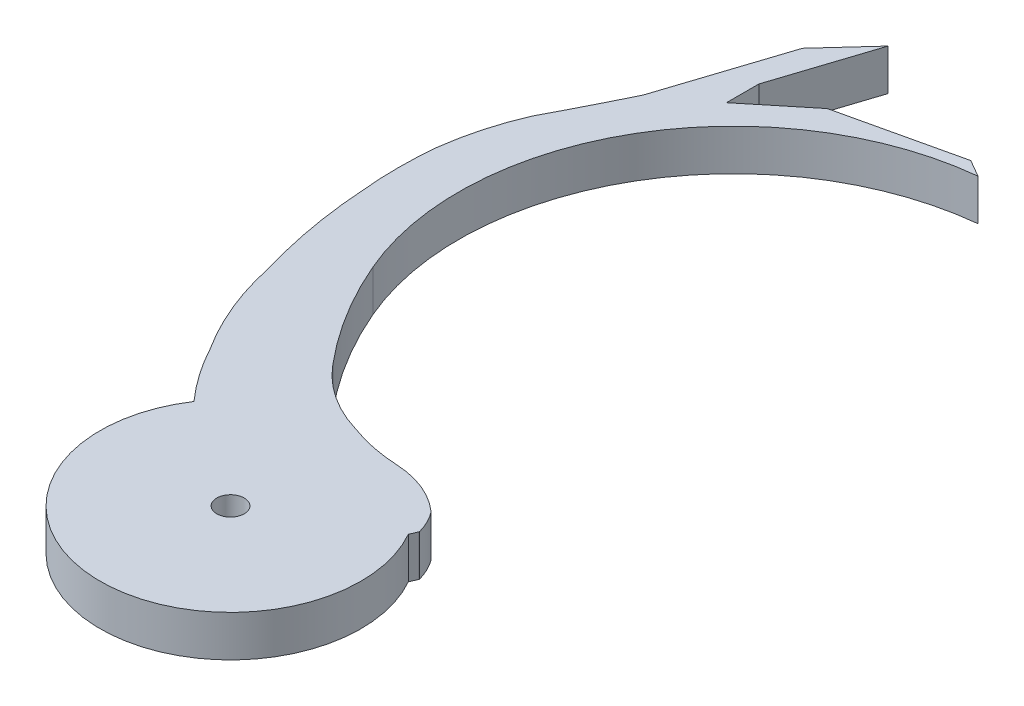
ISO-10303-21;
HEADER;
FILE_DESCRIPTION(('STEP AP214'),'2;1');
FILE_NAME('part.step','',(''),(''),'','','');
FILE_SCHEMA(('AUTOMOTIVE_DESIGN { 1 0 10303 214 1 1 1 1 }'));
ENDSEC;
DATA;
#1=APPLICATION_CONTEXT('core data for automotive mechanical design processes');
#2=APPLICATION_PROTOCOL_DEFINITION('international standard','automotive_design',2000,#1);
#3=PRODUCT_CONTEXT('',#1,'mechanical');
#4=PRODUCT('Part','Part','',(#3));
#5=PRODUCT_RELATED_PRODUCT_CATEGORY('part','',(#4));
#6=PRODUCT_DEFINITION_FORMATION('','',#4);
#7=PRODUCT_DEFINITION_CONTEXT('part definition',#1,'design');
#8=PRODUCT_DEFINITION('design','',#6,#7);
#9=PRODUCT_DEFINITION_SHAPE('','',#8);
#10=(LENGTH_UNIT() NAMED_UNIT(*) SI_UNIT(.MILLI.,.METRE.));
#11=(NAMED_UNIT(*) PLANE_ANGLE_UNIT() SI_UNIT($,.RADIAN.));
#12=(NAMED_UNIT(*) SI_UNIT($,.STERADIAN.) SOLID_ANGLE_UNIT());
#13=UNCERTAINTY_MEASURE_WITH_UNIT(LENGTH_MEASURE(1.E-05),#10,'distance_accuracy_value','');
#14=(GEOMETRIC_REPRESENTATION_CONTEXT(3) GLOBAL_UNCERTAINTY_ASSIGNED_CONTEXT((#13)) GLOBAL_UNIT_ASSIGNED_CONTEXT((#10,
#11,#12)) REPRESENTATION_CONTEXT('',''));
#15=CARTESIAN_POINT('',(0.,0.,0.));
#16=DIRECTION('',(0.,0.,1.));
#17=DIRECTION('',(1.,0.,0.));
#18=AXIS2_PLACEMENT_3D('',#15,#16,#17);
#19=CARTESIAN_POINT('',(-22.562440081917,4.06663709645986,-11.3836875645976));
#20=DIRECTION('',(1.,0.,0.));
#21=DIRECTION('',(0.,0.,-1.));
#22=AXIS2_PLACEMENT_3D('',#19,#20,#21);
#23=PLANE('',#22);
#24=DIRECTION('',(0.,0.,1.));
#25=VECTOR('',#24,1.);
#26=CARTESIAN_POINT('',(-22.562440081917,-1.18336290354014,-11.3836875645976));
#27=LINE('',#26,#25);
#28=CARTESIAN_POINT('',(-22.5624400819171,-1.18336290354014,-43.9022030869811));
#29=VERTEX_POINT('',#28);
#30=CARTESIAN_POINT('',(-22.562440081917,-1.18336290354014,-39.7742396032978));
#31=VERTEX_POINT('',#30);
#32=EDGE_CURVE('E222',#29,#31,#27,.T.);
#33=ORIENTED_EDGE('',*,*,#32,.F.);
#34=DIRECTION('',(0.,-1.,0.));
#35=VECTOR('',#34,1.);
#36=CARTESIAN_POINT('',(-22.5624400819171,4.06663709645986,-43.9022030869811));
#37=LINE('',#36,#35);
#38=CARTESIAN_POINT('',(-22.5624400819171,4.06663709645986,-43.9022030869811));
#39=VERTEX_POINT('',#38);
#40=EDGE_CURVE('E11',#39,#29,#37,.T.);
#41=ORIENTED_EDGE('',*,*,#40,.F.);
#42=DIRECTION('',(0.,0.,1.));
#43=VECTOR('',#42,1.);
#44=CARTESIAN_POINT('',(-22.562440081917,4.06663709645986,-11.3836875645976));
#45=LINE('',#44,#43);
#46=CARTESIAN_POINT('',(-22.562440081917,4.06663709645986,-39.7742396032978));
#47=VERTEX_POINT('',#46);
#48=EDGE_CURVE('E270',#39,#47,#45,.T.);
#49=ORIENTED_EDGE('',*,*,#48,.T.);
#50=DIRECTION('',(0.,-1.,0.));
#51=VECTOR('',#50,1.);
#52=CARTESIAN_POINT('',(-22.562440081917,4.06663709645986,-39.7742396032978));
#53=LINE('',#52,#51);
#54=EDGE_CURVE('E134',#47,#31,#53,.T.);
#55=ORIENTED_EDGE('',*,*,#54,.T.);
#56=EDGE_LOOP('',(#33,#41,#49,#55));
#57=FACE_BOUND('',#56,.T.);
#58=ADVANCED_FACE('F41',(#57),#23,.T.);
#59=CARTESIAN_POINT('',(-28.7450944321391,4.06663709645986,-24.9176323786269));
#60=DIRECTION('',(0.9508473764207,0.,0.30965992112941));
#61=DIRECTION('',(0.30965992112941,0.,-0.9508473764207));
#62=AXIS2_PLACEMENT_3D('',#59,#60,#61);
#63=PLANE('',#62);
#64=DIRECTION('',(-0.30965992112941,0.,0.9508473764207));
#65=VECTOR('',#64,1.);
#66=CARTESIAN_POINT('',(-28.7450944321391,-1.18336290354014,-24.9176323786269));
#67=LINE('',#66,#65);
#68=CARTESIAN_POINT('',(-18.5190078594824,-1.18336290354014,-56.3180394871661));
#69=VERTEX_POINT('',#68);
#70=EDGE_CURVE('E225',#69,#29,#67,.T.);
#71=ORIENTED_EDGE('',*,*,#70,.F.);
#72=DIRECTION('',(0.,-1.,0.));
#73=VECTOR('',#72,1.);
#74=CARTESIAN_POINT('',(-18.5190078594824,4.06663709645986,-56.3180394871661));
#75=LINE('',#74,#73);
#76=CARTESIAN_POINT('',(-18.5190078594824,4.06663709645986,-56.3180394871661));
#77=VERTEX_POINT('',#76);
#78=EDGE_CURVE('E50',#77,#69,#75,.T.);
#79=ORIENTED_EDGE('',*,*,#78,.F.);
#80=DIRECTION('',(-0.30965992112941,0.,0.9508473764207));
#81=VECTOR('',#80,1.);
#82=CARTESIAN_POINT('',(-28.7450944321391,4.06663709645986,-24.9176323786269));
#83=LINE('',#82,#81);
#84=EDGE_CURVE('E335',#77,#39,#83,.T.);
#85=ORIENTED_EDGE('',*,*,#84,.T.);
#86=ORIENTED_EDGE('',*,*,#40,.T.);
#87=EDGE_LOOP('',(#71,#79,#85,#86));
#88=FACE_BOUND('',#87,.T.);
#89=ADVANCED_FACE('F334',(#88),#63,.T.);
#90=CARTESIAN_POINT('',(-26.6414658537518,4.06663709645986,-47.4269807712445));
#91=DIRECTION('',(0.738297960081065,0.,0.674474700889617));
#92=DIRECTION('',(0.674474700889617,0.,-0.738297960081065));
#93=AXIS2_PLACEMENT_3D('',#90,#91,#92);
#94=PLANE('',#93);
#95=DIRECTION('',(-0.674474700889617,0.,0.738297960081065));
#96=VECTOR('',#95,1.);
#97=CARTESIAN_POINT('',(-26.6414658537518,-1.18336290354014,-47.4269807712445));
#98=LINE('',#97,#96);
#99=CARTESIAN_POINT('',(-23.7263406167607,-1.18336290354014,-50.6179544475183));
#100=VERTEX_POINT('',#99);
#101=EDGE_CURVE('E228',#69,#100,#98,.T.);
#102=ORIENTED_EDGE('',*,*,#101,.T.);
#103=DIRECTION('',(0.,-1.,0.));
#104=VECTOR('',#103,1.);
#105=CARTESIAN_POINT('',(-23.7263406167607,4.06663709645986,-50.6179544475183));
#106=LINE('',#105,#104);
#107=CARTESIAN_POINT('',(-23.7263406167607,4.06663709645986,-50.6179544475183));
#108=VERTEX_POINT('',#107);
#109=EDGE_CURVE('E317',#108,#100,#106,.T.);
#110=ORIENTED_EDGE('',*,*,#109,.F.);
#111=DIRECTION('',(-0.674474700889617,0.,0.738297960081065));
#112=VECTOR('',#111,1.);
#113=CARTESIAN_POINT('',(-26.6414658537518,4.06663709645986,-47.4269807712445));
#114=LINE('',#113,#112);
#115=EDGE_CURVE('E325',#77,#108,#114,.T.);
#116=ORIENTED_EDGE('',*,*,#115,.F.);
#117=ORIENTED_EDGE('',*,*,#78,.T.);
#118=EDGE_LOOP('',(#102,#110,#116,#117));
#119=FACE_BOUND('',#118,.T.);
#120=ADVANCED_FACE('F323',(#119),#94,.F.);
#121=CARTESIAN_POINT('',(-31.7747706861074,4.06663709645986,-25.9042989384933));
#122=DIRECTION('',(0.950847376420702,0.,0.309659921129401));
#123=DIRECTION('',(0.309659921129401,0.,-0.950847376420702));
#124=AXIS2_PLACEMENT_3D('',#121,#122,#123);
#125=PLANE('',#124);
#126=DIRECTION('',(-0.309659921129401,0.,0.950847376420703));
#127=VECTOR('',#126,1.);
#128=CARTESIAN_POINT('',(-31.7747706861074,-1.18336290354014,-25.9042989384933));
#129=LINE('',#128,#127);
#130=CARTESIAN_POINT('',(-28.708043021893,-1.18336290354014,-35.3210485878498));
#131=VERTEX_POINT('',#130);
#132=EDGE_CURVE('E230',#100,#131,#129,.T.);
#133=ORIENTED_EDGE('',*,*,#132,.T.);
#134=DIRECTION('',(0.,-1.,0.));
#135=VECTOR('',#134,1.);
#136=CARTESIAN_POINT('',(-28.708043021893,4.06663709645986,-35.3210485878498));
#137=LINE('',#136,#135);
#138=CARTESIAN_POINT('',(-28.708043021893,4.06663709645986,-35.3210485878498));
#139=VERTEX_POINT('',#138);
#140=EDGE_CURVE('E314',#139,#131,#137,.T.);
#141=ORIENTED_EDGE('',*,*,#140,.F.);
#142=DIRECTION('',(-0.309659921129401,0.,0.950847376420703));
#143=VECTOR('',#142,1.);
#144=CARTESIAN_POINT('',(-31.7747706861074,4.06663709645986,-25.9042989384933));
#145=LINE('',#144,#143);
#146=EDGE_CURVE('E344',#108,#139,#145,.T.);
#147=ORIENTED_EDGE('',*,*,#146,.F.);
#148=ORIENTED_EDGE('',*,*,#109,.T.);
#149=EDGE_LOOP('',(#133,#141,#147,#148));
#150=FACE_BOUND('',#149,.T.);
#151=ADVANCED_FACE('F448',(#150),#125,.F.);
#152=CARTESIAN_POINT('',(-295.873895869123,4.06663709645986,-164.689659395593));
#153=DIRECTION('',(0.,-1.,0.));
#154=DIRECTION('',(0.,0.,-1.));
#155=AXIS2_PLACEMENT_3D('',#152,#153,#154);
#156=CYLINDRICAL_SURFACE('',#155,296.8397385626);
#157=CARTESIAN_POINT('',(-295.873895869123,-1.18336290354014,-164.689659395593));
#158=DIRECTION('',(0.,1.,0.));
#159=DIRECTION('',(0.,0.,1.));
#160=AXIS2_PLACEMENT_3D('',#157,#158,#159);
#161=CIRCLE('',#160,296.8397385626);
#162=CARTESIAN_POINT('',(-33.4652339449699,-1.18336290354014,-25.9253825189827));
#163=VERTEX_POINT('',#162);
#164=EDGE_CURVE('E232',#131,#163,#161,.F.);
#165=ORIENTED_EDGE('',*,*,#164,.T.);
#166=DIRECTION('',(0.,-1.,0.));
#167=VECTOR('',#166,1.);
#168=CARTESIAN_POINT('',(-33.4652339449699,4.06663709645986,-25.9253825189827));
#169=LINE('',#168,#167);
#170=CARTESIAN_POINT('',(-33.4652339449699,4.06663709645986,-25.9253825189827));
#171=VERTEX_POINT('',#170);
#172=EDGE_CURVE('E311',#171,#163,#169,.T.);
#173=ORIENTED_EDGE('',*,*,#172,.F.);
#174=CARTESIAN_POINT('',(-295.873895869123,4.06663709645986,-164.689659395593));
#175=DIRECTION('',(0.,1.,0.));
#176=DIRECTION('',(0.,0.,1.));
#177=AXIS2_PLACEMENT_3D('',#174,#175,#176);
#178=CIRCLE('',#177,296.8397385626);
#179=EDGE_CURVE('E346',#139,#171,#178,.F.);
#180=ORIENTED_EDGE('',*,*,#179,.F.);
#181=ORIENTED_EDGE('',*,*,#140,.T.);
#182=EDGE_LOOP('',(#165,#173,#180,#181));
#183=FACE_BOUND('',#182,.T.);
#184=ADVANCED_FACE('F443',(#183),#156,.F.);
#185=CARTESIAN_POINT('',(-1.11166103626462,4.06663709645986,-11.9503457248283));
#186=DIRECTION('',(0.,-1.,0.));
#187=DIRECTION('',(0.,0.,-1.));
#188=AXIS2_PLACEMENT_3D('',#185,#186,#187);
#189=CYLINDRICAL_SURFACE('',#188,35.2428054126922);
#190=CARTESIAN_POINT('',(-1.11166103626462,-1.18336290354014,-11.9503457248283));
#191=DIRECTION('',(0.,1.,0.));
#192=DIRECTION('',(0.,0.,1.));
#193=AXIS2_PLACEMENT_3D('',#190,#191,#192);
#194=CIRCLE('',#193,35.2428054126922);
#195=CARTESIAN_POINT('',(-36.0771724864214,-1.18336290354014,-16.3626401830255));
#196=VERTEX_POINT('',#195);
#197=EDGE_CURVE('E234',#163,#196,#194,.T.);
#198=ORIENTED_EDGE('',*,*,#197,.T.);
#199=DIRECTION('',(0.,-1.,0.));
#200=VECTOR('',#199,1.);
#201=CARTESIAN_POINT('',(-36.0771724864214,4.06663709645986,-16.3626401830255));
#202=LINE('',#201,#200);
#203=CARTESIAN_POINT('',(-36.0771724864214,4.06663709645986,-16.3626401830255));
#204=VERTEX_POINT('',#203);
#205=EDGE_CURVE('E308',#204,#196,#202,.T.);
#206=ORIENTED_EDGE('',*,*,#205,.F.);
#207=CARTESIAN_POINT('',(-1.11166103626462,4.06663709645986,-11.9503457248283));
#208=DIRECTION('',(0.,1.,0.));
#209=DIRECTION('',(0.,0.,1.));
#210=AXIS2_PLACEMENT_3D('',#207,#208,#209);
#211=CIRCLE('',#210,35.2428054126922);
#212=EDGE_CURVE('E348',#171,#204,#211,.T.);
#213=ORIENTED_EDGE('',*,*,#212,.F.);
#214=ORIENTED_EDGE('',*,*,#172,.T.);
#215=EDGE_LOOP('',(#198,#206,#213,#214));
#216=FACE_BOUND('',#215,.T.);
#217=ADVANCED_FACE('F440',(#216),#189,.T.);
#218=CARTESIAN_POINT('',(11.2084770385272,4.06663709645986,-11.6995461847937));
#219=DIRECTION('',(0.,-1.,0.));
#220=DIRECTION('',(0.,0.,-1.));
#221=AXIS2_PLACEMENT_3D('',#218,#219,#220);
#222=CYLINDRICAL_SURFACE('',#221,47.5150196951725);
#223=CARTESIAN_POINT('',(11.2084770385272,-1.18336290354014,-11.6995461847937));
#224=DIRECTION('',(0.,1.,0.));
#225=DIRECTION('',(0.,0.,1.));
#226=AXIS2_PLACEMENT_3D('',#223,#224,#225);
#227=CIRCLE('',#226,47.5150196951725);
#228=CARTESIAN_POINT('',(-36.0771724864217,-1.18336290354014,-7.03645218656275));
#229=VERTEX_POINT('',#228);
#230=EDGE_CURVE('E236',#196,#229,#227,.T.);
#231=ORIENTED_EDGE('',*,*,#230,.T.);
#232=DIRECTION('',(0.,-1.,0.));
#233=VECTOR('',#232,1.);
#234=CARTESIAN_POINT('',(-36.0771724864217,4.06663709645986,-7.03645218656275));
#235=LINE('',#234,#233);
#236=CARTESIAN_POINT('',(-36.0771724864217,4.06663709645986,-7.03645218656275));
#237=VERTEX_POINT('',#236);
#238=EDGE_CURVE('E305',#237,#229,#235,.T.);
#239=ORIENTED_EDGE('',*,*,#238,.F.);
#240=CARTESIAN_POINT('',(11.2084770385272,4.06663709645986,-11.6995461847937));
#241=DIRECTION('',(0.,1.,0.));
#242=DIRECTION('',(0.,0.,1.));
#243=AXIS2_PLACEMENT_3D('',#240,#241,#242);
#244=CIRCLE('',#243,47.5150196951725);
#245=EDGE_CURVE('E350',#204,#237,#244,.T.);
#246=ORIENTED_EDGE('',*,*,#245,.F.);
#247=ORIENTED_EDGE('',*,*,#205,.T.);
#248=EDGE_LOOP('',(#231,#239,#246,#247));
#249=FACE_BOUND('',#248,.T.);
#250=ADVANCED_FACE('F436',(#249),#222,.T.);
#251=CARTESIAN_POINT('',(30.3596903971524,4.06663709645986,-11.3073960036639));
#252=DIRECTION('',(0.,-1.,0.));
#253=DIRECTION('',(0.,0.,-1.));
#254=AXIS2_PLACEMENT_3D('',#251,#252,#253);
#255=CYLINDRICAL_SURFACE('',#254,66.5740017641998);
#256=CARTESIAN_POINT('',(30.3596903971524,-1.18336290354014,-11.3073960036639));
#257=DIRECTION('',(0.,1.,0.));
#258=DIRECTION('',(0.,0.,1.));
#259=AXIS2_PLACEMENT_3D('',#256,#257,#258);
#260=CIRCLE('',#259,66.5740017641998);
#261=CARTESIAN_POINT('',(-33.4652339449706,-1.18336290354014,7.6260860749701));
#262=VERTEX_POINT('',#261);
#263=EDGE_CURVE('E238',#229,#262,#260,.T.);
#264=ORIENTED_EDGE('',*,*,#263,.T.);
#265=DIRECTION('',(0.,-1.,0.));
#266=VECTOR('',#265,1.);
#267=CARTESIAN_POINT('',(-33.4652339449706,4.06663709645986,7.6260860749701));
#268=LINE('',#267,#266);
#269=CARTESIAN_POINT('',(-33.4652339449706,4.06663709645986,7.6260860749701));
#270=VERTEX_POINT('',#269);
#271=EDGE_CURVE('E302',#270,#262,#268,.T.);
#272=ORIENTED_EDGE('',*,*,#271,.F.);
#273=CARTESIAN_POINT('',(30.3596903971524,4.06663709645986,-11.3073960036639));
#274=DIRECTION('',(0.,1.,0.));
#275=DIRECTION('',(0.,0.,1.));
#276=AXIS2_PLACEMENT_3D('',#273,#274,#275);
#277=CIRCLE('',#276,66.5740017641998);
#278=EDGE_CURVE('E352',#237,#270,#277,.T.);
#279=ORIENTED_EDGE('',*,*,#278,.F.);
#280=ORIENTED_EDGE('',*,*,#238,.T.);
#281=EDGE_LOOP('',(#264,#272,#279,#280));
#282=FACE_BOUND('',#281,.T.);
#283=ADVANCED_FACE('F431',(#282),#255,.T.);
#284=CARTESIAN_POINT('',(3.46931508674213,4.06663709645986,-0.0838468615025354));
#285=DIRECTION('',(0.,-1.,0.));
#286=DIRECTION('',(0.,0.,-1.));
#287=AXIS2_PLACEMENT_3D('',#284,#285,#286);
#288=CYLINDRICAL_SURFACE('',#287,37.7306768831535);
#289=CARTESIAN_POINT('',(3.46931508674213,-1.18336290354014,-0.0838468615025354));
#290=DIRECTION('',(0.,1.,0.));
#291=DIRECTION('',(0.,0.,1.));
#292=AXIS2_PLACEMENT_3D('',#289,#290,#291);
#293=CIRCLE('',#292,37.7306768831535);
#294=CARTESIAN_POINT('',(-28.2921737135603,-1.18336290354014,20.283082392786));
#295=VERTEX_POINT('',#294);
#296=EDGE_CURVE('E240',#262,#295,#293,.T.);
#297=ORIENTED_EDGE('',*,*,#296,.T.);
#298=DIRECTION('',(0.,-1.,0.));
#299=VECTOR('',#298,1.);
#300=CARTESIAN_POINT('',(-28.2921737135603,4.06663709645986,20.283082392786));
#301=LINE('',#300,#299);
#302=CARTESIAN_POINT('',(-28.2921737135603,4.06663709645986,20.283082392786));
#303=VERTEX_POINT('',#302);
#304=EDGE_CURVE('E299',#303,#295,#301,.T.);
#305=ORIENTED_EDGE('',*,*,#304,.F.);
#306=CARTESIAN_POINT('',(3.46931508674213,4.06663709645986,-0.0838468615025354));
#307=DIRECTION('',(0.,1.,0.));
#308=DIRECTION('',(0.,0.,1.));
#309=AXIS2_PLACEMENT_3D('',#306,#307,#308);
#310=CIRCLE('',#309,37.7306768831535);
#311=EDGE_CURVE('E354',#270,#303,#310,.T.);
#312=ORIENTED_EDGE('',*,*,#311,.F.);
#313=ORIENTED_EDGE('',*,*,#271,.T.);
#314=EDGE_LOOP('',(#297,#305,#312,#313));
#315=FACE_BOUND('',#314,.T.);
#316=ADVANCED_FACE('F425',(#315),#288,.T.);
#317=CARTESIAN_POINT('',(3.06716016202229,4.06663709645986,3.48158752148587));
#318=DIRECTION('',(0.,-1.,0.));
#319=DIRECTION('',(0.,0.,-1.));
#320=AXIS2_PLACEMENT_3D('',#317,#318,#319);
#321=CYLINDRICAL_SURFACE('',#320,35.5766503627102);
#322=CARTESIAN_POINT('',(3.06716016202229,-1.18336290354014,3.48158752148587));
#323=DIRECTION('',(0.,1.,0.));
#324=DIRECTION('',(0.,0.,1.));
#325=AXIS2_PLACEMENT_3D('',#322,#323,#324);
#326=CIRCLE('',#325,35.5766503627102);
#327=CARTESIAN_POINT('',(-23.5142574569107,-1.18336290354014,27.1274389207993));
#328=VERTEX_POINT('',#327);
#329=EDGE_CURVE('E242',#295,#328,#326,.T.);
#330=ORIENTED_EDGE('',*,*,#329,.T.);
#331=DIRECTION('',(0.,-1.,0.));
#332=VECTOR('',#331,1.);
#333=CARTESIAN_POINT('',(-23.5142574569107,4.06663709645986,27.1274389207993));
#334=LINE('',#333,#332);
#335=CARTESIAN_POINT('',(-23.5142574569107,4.06663709645986,27.1274389207993));
#336=VERTEX_POINT('',#335);
#337=EDGE_CURVE('E296',#336,#328,#334,.T.);
#338=ORIENTED_EDGE('',*,*,#337,.F.);
#339=CARTESIAN_POINT('',(3.06716016202229,4.06663709645986,3.48158752148587));
#340=DIRECTION('',(0.,1.,0.));
#341=DIRECTION('',(0.,0.,1.));
#342=AXIS2_PLACEMENT_3D('',#339,#340,#341);
#343=CIRCLE('',#342,35.5766503627102);
#344=EDGE_CURVE('E356',#303,#336,#343,.T.);
#345=ORIENTED_EDGE('',*,*,#344,.F.);
#346=ORIENTED_EDGE('',*,*,#304,.T.);
#347=EDGE_LOOP('',(#330,#338,#345,#346));
#348=FACE_BOUND('',#347,.T.);
#349=ADVANCED_FACE('F421',(#348),#321,.T.);
#350=CARTESIAN_POINT('',(-9.66416609923461,4.06663709645986,36.323394248226));
#351=DIRECTION('',(0.,-1.,0.));
#352=DIRECTION('',(0.,0.,-1.));
#353=AXIS2_PLACEMENT_3D('',#350,#351,#352);
#354=CYLINDRICAL_SURFACE('',#353,16.625);
#355=CARTESIAN_POINT('',(-9.66416609923461,-1.18336290354014,36.323394248226));
#356=DIRECTION('',(0.,1.,0.));
#357=DIRECTION('',(0.,0.,1.));
#358=AXIS2_PLACEMENT_3D('',#355,#356,#357);
#359=CIRCLE('',#358,16.625);
#360=CARTESIAN_POINT('',(4.79349583227801,-1.18336290354014,28.1156761442648));
#361=VERTEX_POINT('',#360);
#362=EDGE_CURVE('E244',#328,#361,#359,.T.);
#363=ORIENTED_EDGE('',*,*,#362,.T.);
#364=DIRECTION('',(0.,-1.,0.));
#365=VECTOR('',#364,1.);
#366=CARTESIAN_POINT('',(4.79349583227801,4.06663709645986,28.1156761442648));
#367=LINE('',#366,#365);
#368=CARTESIAN_POINT('',(4.79349583227801,4.06663709645986,28.1156761442648));
#369=VERTEX_POINT('',#368);
#370=EDGE_CURVE('E294',#369,#361,#367,.T.);
#371=ORIENTED_EDGE('',*,*,#370,.F.);
#372=CARTESIAN_POINT('',(-9.66416609923461,4.06663709645986,36.323394248226));
#373=DIRECTION('',(0.,1.,0.));
#374=DIRECTION('',(0.,0.,1.));
#375=AXIS2_PLACEMENT_3D('',#372,#373,#374);
#376=CIRCLE('',#375,16.625);
#377=EDGE_CURVE('E358',#336,#369,#376,.T.);
#378=ORIENTED_EDGE('',*,*,#377,.F.);
#379=ORIENTED_EDGE('',*,*,#337,.T.);
#380=EDGE_LOOP('',(#363,#371,#378,#379));
#381=FACE_BOUND('',#380,.T.);
#382=ADVANCED_FACE('F416',(#381),#354,.T.);
#383=CARTESIAN_POINT('',(-16.4170273846854,4.06663709645986,18.3143532362968));
#384=DIRECTION('',(0.,-1.,0.));
#385=DIRECTION('',(0.,0.,-1.));
#386=AXIS2_PLACEMENT_3D('',#383,#384,#385);
#387=CYLINDRICAL_SURFACE('',#386,23.3656205970139);
#388=CARTESIAN_POINT('',(-16.4170273846854,-1.18336290354014,18.3143532362968));
#389=DIRECTION('',(0.,1.,0.));
#390=DIRECTION('',(0.,0.,1.));
#391=AXIS2_PLACEMENT_3D('',#388,#389,#390);
#392=CIRCLE('',#391,23.3656205970139);
#393=CARTESIAN_POINT('',(5.20948538279703,-1.18336290354014,27.160039834946));
#394=VERTEX_POINT('',#393);
#395=EDGE_CURVE('E247',#394,#361,#392,.F.);
#396=ORIENTED_EDGE('',*,*,#395,.F.);
#397=DIRECTION('',(0.,-1.,0.));
#398=VECTOR('',#397,1.);
#399=CARTESIAN_POINT('',(5.20948538279703,4.06663709645986,27.160039834946));
#400=LINE('',#399,#398);
#401=CARTESIAN_POINT('',(5.20948538279703,4.06663709645986,27.160039834946));
#402=VERTEX_POINT('',#401);
#403=EDGE_CURVE('E292',#402,#394,#400,.T.);
#404=ORIENTED_EDGE('',*,*,#403,.F.);
#405=CARTESIAN_POINT('',(-16.4170273846854,4.06663709645986,18.3143532362968));
#406=DIRECTION('',(0.,1.,0.));
#407=DIRECTION('',(0.,0.,1.));
#408=AXIS2_PLACEMENT_3D('',#405,#406,#407);
#409=CIRCLE('',#408,23.3656205970139);
#410=EDGE_CURVE('E360',#402,#369,#409,.F.);
#411=ORIENTED_EDGE('',*,*,#410,.T.);
#412=ORIENTED_EDGE('',*,*,#370,.T.);
#413=EDGE_LOOP('',(#396,#404,#411,#412));
#414=FACE_BOUND('',#413,.T.);
#415=ADVANCED_FACE('F410',(#414),#387,.T.);
#416=CARTESIAN_POINT('',(13.4560748934009,4.06663709645986,29.3685048818782));
#417=DIRECTION('',(0.,-1.,0.));
#418=DIRECTION('',(0.,0.,-1.));
#419=AXIS2_PLACEMENT_3D('',#416,#417,#418);
#420=CYLINDRICAL_SURFACE('',#419,8.53718668062977);
#421=CARTESIAN_POINT('',(13.4560748934009,-1.18336290354014,29.3685048818782));
#422=DIRECTION('',(0.,1.,0.));
#423=DIRECTION('',(0.,0.,1.));
#424=AXIS2_PLACEMENT_3D('',#421,#422,#423);
#425=CIRCLE('',#424,8.53718668062977);
#426=CARTESIAN_POINT('',(5.22205920493274,-1.18336290354014,27.1136119660209));
#427=VERTEX_POINT('',#426);
#428=EDGE_CURVE('E250',#394,#427,#425,.F.);
#429=ORIENTED_EDGE('',*,*,#428,.T.);
#430=DIRECTION('',(0.,-1.,0.));
#431=VECTOR('',#430,1.);
#432=CARTESIAN_POINT('',(5.22205920493274,4.06663709645986,27.1136119660209));
#433=LINE('',#432,#431);
#434=CARTESIAN_POINT('',(5.22205920493274,4.06663709645986,27.1136119660209));
#435=VERTEX_POINT('',#434);
#436=EDGE_CURVE('E289',#435,#427,#433,.T.);
#437=ORIENTED_EDGE('',*,*,#436,.F.);
#438=CARTESIAN_POINT('',(13.4560748934009,4.06663709645986,29.3685048818782));
#439=DIRECTION('',(0.,1.,0.));
#440=DIRECTION('',(0.,0.,1.));
#441=AXIS2_PLACEMENT_3D('',#438,#439,#440);
#442=CIRCLE('',#441,8.53718668062977);
#443=EDGE_CURVE('E363',#402,#435,#442,.F.);
#444=ORIENTED_EDGE('',*,*,#443,.F.);
#445=ORIENTED_EDGE('',*,*,#403,.T.);
#446=EDGE_LOOP('',(#429,#437,#444,#445));
#447=FACE_BOUND('',#446,.T.);
#448=ADVANCED_FACE('F407',(#447),#420,.F.);
#449=CARTESIAN_POINT('',(-3.01195648353538,4.06663709645986,29.3685048818782));
#450=DIRECTION('',(0.,-1.,0.));
#451=DIRECTION('',(0.,0.,-1.));
#452=AXIS2_PLACEMENT_3D('',#449,#450,#451);
#453=CYLINDRICAL_SURFACE('',#452,8.53718668062977);
#454=CARTESIAN_POINT('',(-3.01195648353538,-1.18336290354014,29.3685048818782));
#455=DIRECTION('',(0.,1.,0.));
#456=DIRECTION('',(0.,0.,1.));
#457=AXIS2_PLACEMENT_3D('',#454,#455,#456);
#458=CIRCLE('',#457,8.53718668062977);
#459=CARTESIAN_POINT('',(3.79038949061149,-1.18336290354014,24.2098572230503));
#460=VERTEX_POINT('',#459);
#461=EDGE_CURVE('E252',#427,#460,#458,.T.);
#462=ORIENTED_EDGE('',*,*,#461,.T.);
#463=DIRECTION('',(0.,-1.,0.));
#464=VECTOR('',#463,1.);
#465=CARTESIAN_POINT('',(3.79038949061149,4.06663709645986,24.2098572230503));
#466=LINE('',#465,#464);
#467=CARTESIAN_POINT('',(3.79038949061149,4.06663709645986,24.2098572230503));
#468=VERTEX_POINT('',#467);
#469=EDGE_CURVE('E286',#468,#460,#466,.T.);
#470=ORIENTED_EDGE('',*,*,#469,.F.);
#471=CARTESIAN_POINT('',(-3.01195648353538,4.06663709645986,29.3685048818782));
#472=DIRECTION('',(0.,1.,0.));
#473=DIRECTION('',(0.,0.,1.));
#474=AXIS2_PLACEMENT_3D('',#471,#472,#473);
#475=CIRCLE('',#474,8.53718668062977);
#476=EDGE_CURVE('E365',#435,#468,#475,.T.);
#477=ORIENTED_EDGE('',*,*,#476,.F.);
#478=ORIENTED_EDGE('',*,*,#436,.T.);
#479=EDGE_LOOP('',(#462,#470,#477,#478));
#480=FACE_BOUND('',#479,.T.);
#481=ADVANCED_FACE('F402',(#480),#453,.T.);
#482=CARTESIAN_POINT('',(-4.14462649044132,4.06663709645986,33.1042035083881));
#483=DIRECTION('',(0.,-1.,0.));
#484=DIRECTION('',(0.,0.,-1.));
#485=AXIS2_PLACEMENT_3D('',#482,#483,#484);
#486=CYLINDRICAL_SURFACE('',#485,11.9194745883812);
#487=CARTESIAN_POINT('',(-4.14462649044132,-1.18336290354014,33.1042035083881));
#488=DIRECTION('',(0.,1.,0.));
#489=DIRECTION('',(0.,0.,1.));
#490=AXIS2_PLACEMENT_3D('',#487,#488,#489);
#491=CIRCLE('',#490,11.9194745883812);
#492=CARTESIAN_POINT('',(-3.57079659150943,-1.18336290354014,21.1985496535947));
#493=VERTEX_POINT('',#492);
#494=EDGE_CURVE('E254',#460,#493,#491,.T.);
#495=ORIENTED_EDGE('',*,*,#494,.T.);
#496=DIRECTION('',(0.,-1.,0.));
#497=VECTOR('',#496,1.);
#498=CARTESIAN_POINT('',(-3.57079659150943,4.06663709645986,21.1985496535947));
#499=LINE('',#498,#497);
#500=CARTESIAN_POINT('',(-3.57079659150943,4.06663709645986,21.1985496535947));
#501=VERTEX_POINT('',#500);
#502=EDGE_CURVE('E283',#501,#493,#499,.T.);
#503=ORIENTED_EDGE('',*,*,#502,.F.);
#504=CARTESIAN_POINT('',(-4.14462649044132,4.06663709645986,33.1042035083881));
#505=DIRECTION('',(0.,1.,0.));
#506=DIRECTION('',(0.,0.,1.));
#507=AXIS2_PLACEMENT_3D('',#504,#505,#506);
#508=CIRCLE('',#507,11.9194745883812);
#509=EDGE_CURVE('E367',#468,#501,#508,.T.);
#510=ORIENTED_EDGE('',*,*,#509,.F.);
#511=ORIENTED_EDGE('',*,*,#469,.T.);
#512=EDGE_LOOP('',(#495,#503,#510,#511));
#513=FACE_BOUND('',#512,.T.);
#514=ADVANCED_FACE('F396',(#513),#486,.T.);
#515=CARTESIAN_POINT('',(-2.50499563247774,4.06663709645986,-0.914374960401413));
#516=DIRECTION('',(0.,-1.,0.));
#517=DIRECTION('',(0.,0.,-1.));
#518=AXIS2_PLACEMENT_3D('',#515,#516,#517);
#519=CYLINDRICAL_SURFACE('',#518,22.1385945052649);
#520=CARTESIAN_POINT('',(-2.50499563247774,-1.18336290354014,-0.914374960401413));
#521=DIRECTION('',(0.,1.,0.));
#522=DIRECTION('',(0.,0.,1.));
#523=AXIS2_PLACEMENT_3D('',#520,#521,#522);
#524=CIRCLE('',#523,22.1385945052649);
#525=CARTESIAN_POINT('',(-10.2003482828133,-1.18336290354014,19.8437298243693));
#526=VERTEX_POINT('',#525);
#527=EDGE_CURVE('E256',#493,#526,#524,.F.);
#528=ORIENTED_EDGE('',*,*,#527,.T.);
#529=DIRECTION('',(0.,-1.,0.));
#530=VECTOR('',#529,1.);
#531=CARTESIAN_POINT('',(-10.2003482828133,4.06663709645986,19.8437298243693));
#532=LINE('',#531,#530);
#533=CARTESIAN_POINT('',(-10.2003482828133,4.06663709645986,19.8437298243693));
#534=VERTEX_POINT('',#533);
#535=EDGE_CURVE('E280',#534,#526,#532,.T.);
#536=ORIENTED_EDGE('',*,*,#535,.F.);
#537=CARTESIAN_POINT('',(-2.50499563247774,4.06663709645986,-0.914374960401413));
#538=DIRECTION('',(0.,1.,0.));
#539=DIRECTION('',(0.,0.,1.));
#540=AXIS2_PLACEMENT_3D('',#537,#538,#539);
#541=CIRCLE('',#540,22.1385945052649);
#542=EDGE_CURVE('E369',#501,#534,#541,.F.);
#543=ORIENTED_EDGE('',*,*,#542,.F.);
#544=ORIENTED_EDGE('',*,*,#502,.T.);
#545=EDGE_LOOP('',(#528,#536,#543,#544));
#546=FACE_BOUND('',#545,.T.);
#547=ADVANCED_FACE('F392',(#546),#519,.F.);
#548=CARTESIAN_POINT('',(-5.25354003598053,4.06663709645986,3.06597548894517));
#549=DIRECTION('',(0.,-1.,0.));
#550=DIRECTION('',(0.,0.,-1.));
#551=AXIS2_PLACEMENT_3D('',#548,#549,#550);
#552=CYLINDRICAL_SURFACE('',#551,17.4918253012879);
#553=CARTESIAN_POINT('',(-5.25354003598053,-1.18336290354014,3.06597548894517));
#554=DIRECTION('',(0.,1.,0.));
#555=DIRECTION('',(0.,0.,1.));
#556=AXIS2_PLACEMENT_3D('',#553,#554,#555);
#557=CIRCLE('',#556,17.4918253012879);
#558=CARTESIAN_POINT('',(-18.7056623503037,-1.18336290354014,14.2465102530458));
#559=VERTEX_POINT('',#558);
#560=EDGE_CURVE('E258',#526,#559,#557,.F.);
#561=ORIENTED_EDGE('',*,*,#560,.T.);
#562=DIRECTION('',(0.,-1.,0.));
#563=VECTOR('',#562,1.);
#564=CARTESIAN_POINT('',(-18.7056623503037,4.06663709645986,14.2465102530458));
#565=LINE('',#564,#563);
#566=CARTESIAN_POINT('',(-18.7056623503037,4.06663709645986,14.2465102530458));
#567=VERTEX_POINT('',#566);
#568=EDGE_CURVE('E277',#567,#559,#565,.T.);
#569=ORIENTED_EDGE('',*,*,#568,.F.);
#570=CARTESIAN_POINT('',(-5.25354003598053,4.06663709645986,3.06597548894517));
#571=DIRECTION('',(0.,1.,0.));
#572=DIRECTION('',(0.,0.,1.));
#573=AXIS2_PLACEMENT_3D('',#570,#571,#572);
#574=CIRCLE('',#573,17.4918253012879);
#575=EDGE_CURVE('E371',#534,#567,#574,.F.);
#576=ORIENTED_EDGE('',*,*,#575,.F.);
#577=ORIENTED_EDGE('',*,*,#535,.T.);
#578=EDGE_LOOP('',(#561,#569,#576,#577));
#579=FACE_BOUND('',#578,.T.);
#580=ADVANCED_FACE('F388',(#579),#552,.F.);
#581=CARTESIAN_POINT('',(21.7921186772506,4.06663709645986,-19.9825397466189));
#582=DIRECTION('',(0.,-1.,0.));
#583=DIRECTION('',(0.,0.,-1.));
#584=AXIS2_PLACEMENT_3D('',#581,#582,#583);
#585=CYLINDRICAL_SURFACE('',#584,53.0254479663801);
#586=CARTESIAN_POINT('',(21.7921186772506,-1.18336290354014,-19.9825397466189));
#587=DIRECTION('',(0.,1.,0.));
#588=DIRECTION('',(0.,0.,1.));
#589=AXIS2_PLACEMENT_3D('',#586,#587,#588);
#590=CIRCLE('',#589,53.0254479663801);
#591=CARTESIAN_POINT('',(-26.9520139505759,-1.18336290354014,0.891071977185616));
#592=VERTEX_POINT('',#591);
#593=EDGE_CURVE('E260',#559,#592,#590,.F.);
#594=ORIENTED_EDGE('',*,*,#593,.T.);
#595=DIRECTION('',(0.,-1.,0.));
#596=VECTOR('',#595,1.);
#597=CARTESIAN_POINT('',(-26.9520139505759,4.06663709645986,0.891071977185616));
#598=LINE('',#597,#596);
#599=CARTESIAN_POINT('',(-26.9520139505759,4.06663709645986,0.891071977185616));
#600=VERTEX_POINT('',#599);
#601=EDGE_CURVE('E274',#600,#592,#598,.T.);
#602=ORIENTED_EDGE('',*,*,#601,.F.);
#603=CARTESIAN_POINT('',(21.7921186772506,4.06663709645986,-19.9825397466189));
#604=DIRECTION('',(0.,1.,0.));
#605=DIRECTION('',(0.,0.,1.));
#606=AXIS2_PLACEMENT_3D('',#603,#604,#605);
#607=CIRCLE('',#606,53.0254479663801);
#608=EDGE_CURVE('E373',#567,#600,#607,.F.);
#609=ORIENTED_EDGE('',*,*,#608,.F.);
#610=ORIENTED_EDGE('',*,*,#568,.T.);
#611=EDGE_LOOP('',(#594,#602,#609,#610));
#612=FACE_BOUND('',#611,.T.);
#613=ADVANCED_FACE('F379',(#612),#585,.F.);
#614=CARTESIAN_POINT('',(5.22205920493274,4.06663709645986,-12.886773158538));
#615=DIRECTION('',(0.,-1.,0.));
#616=DIRECTION('',(0.,0.,-1.));
#617=AXIS2_PLACEMENT_3D('',#614,#615,#616);
#618=CYLINDRICAL_SURFACE('',#617,35.);
#619=CARTESIAN_POINT('',(5.22205920493274,-1.18336290354014,-12.886773158538));
#620=DIRECTION('',(0.,1.,0.));
#621=DIRECTION('',(0.,0.,1.));
#622=AXIS2_PLACEMENT_3D('',#619,#620,#621);
#623=CIRCLE('',#622,35.);
#624=CARTESIAN_POINT('',(1.5711765973419,-1.18336290354014,-47.695838876905));
#625=VERTEX_POINT('',#624);
#626=EDGE_CURVE('E262',#592,#625,#623,.F.);
#627=ORIENTED_EDGE('',*,*,#626,.T.);
#628=DIRECTION('',(0.,-1.,0.));
#629=VECTOR('',#628,1.);
#630=CARTESIAN_POINT('',(1.5711765973419,4.06663709645986,-47.695838876905));
#631=LINE('',#630,#629);
#632=CARTESIAN_POINT('',(1.5711765973419,4.06663709645986,-47.695838876905));
#633=VERTEX_POINT('',#632);
#634=EDGE_CURVE('E205',#633,#625,#631,.T.);
#635=ORIENTED_EDGE('',*,*,#634,.F.);
#636=CARTESIAN_POINT('',(5.22205920493274,4.06663709645986,-12.886773158538));
#637=DIRECTION('',(0.,1.,0.));
#638=DIRECTION('',(0.,0.,1.));
#639=AXIS2_PLACEMENT_3D('',#636,#637,#638);
#640=CIRCLE('',#639,35.);
#641=EDGE_CURVE('E211',#600,#633,#640,.F.);
#642=ORIENTED_EDGE('',*,*,#641,.F.);
#643=ORIENTED_EDGE('',*,*,#601,.T.);
#644=EDGE_LOOP('',(#627,#635,#642,#643));
#645=FACE_BOUND('',#644,.T.);
#646=ADVANCED_FACE('F383',(#645),#618,.F.);
#647=CARTESIAN_POINT('',(25.737236022188,4.06663709645986,-33.6994165266074));
#648=DIRECTION('',(0.501184996579342,0.,-0.865340163868386));
#649=DIRECTION('',(-0.865340163868386,0.,-0.501184996579342));
#650=AXIS2_PLACEMENT_3D('',#647,#648,#649);
#651=PLANE('',#650);
#652=DIRECTION('',(0.865340163868386,0.,0.501184996579342));
#653=VECTOR('',#652,1.);
#654=CARTESIAN_POINT('',(25.737236022188,-1.18336290354014,-33.6994165266074));
#655=LINE('',#654,#653);
#656=CARTESIAN_POINT('',(-0.606265385907519,-1.18336290354014,-48.9569628816526));
#657=VERTEX_POINT('',#656);
#658=EDGE_CURVE('E200',#657,#625,#655,.T.);
#659=ORIENTED_EDGE('',*,*,#658,.F.);
#660=DIRECTION('',(0.,-1.,0.));
#661=VECTOR('',#660,1.);
#662=CARTESIAN_POINT('',(-0.606265385907519,4.06663709645986,-48.9569628816526));
#663=LINE('',#662,#661);
#664=CARTESIAN_POINT('',(-0.606265385907519,4.06663709645986,-48.9569628816526));
#665=VERTEX_POINT('',#664);
#666=EDGE_CURVE('E195',#665,#657,#663,.T.);
#667=ORIENTED_EDGE('',*,*,#666,.F.);
#668=DIRECTION('',(0.865340163868386,0.,0.501184996579342));
#669=VECTOR('',#668,1.);
#670=CARTESIAN_POINT('',(25.737236022188,4.06663709645986,-33.6994165266074));
#671=LINE('',#670,#669);
#672=EDGE_CURVE('E198',#665,#633,#671,.T.);
#673=ORIENTED_EDGE('',*,*,#672,.T.);
#674=ORIENTED_EDGE('',*,*,#634,.T.);
#675=EDGE_LOOP('',(#659,#667,#673,#674));
#676=FACE_BOUND('',#675,.T.);
#677=ADVANCED_FACE('F197',(#676),#651,.T.);
#678=CARTESIAN_POINT('',(3.96269913456155,4.06663709645986,-50.0039355752669));
#679=DIRECTION('',(-0.223359601164946,0.,-0.974736112272155));
#680=DIRECTION('',(-0.974736112272156,0.,0.223359601164946));
#681=AXIS2_PLACEMENT_3D('',#678,#679,#680);
#682=PLANE('',#681);
#683=DIRECTION('',(0.974736112272156,0.,-0.223359601164946));
#684=VECTOR('',#683,1.);
#685=CARTESIAN_POINT('',(3.96269913456155,-1.18336290354014,-50.0039355752669));
#686=LINE('',#685,#684);
#687=CARTESIAN_POINT('',(-15.4901181034909,-1.18336290354014,-45.5463460337266));
#688=VERTEX_POINT('',#687);
#689=EDGE_CURVE('E266',#688,#657,#686,.T.);
#690=ORIENTED_EDGE('',*,*,#689,.F.);
#691=DIRECTION('',(0.,-1.,0.));
#692=VECTOR('',#691,1.);
#693=CARTESIAN_POINT('',(-15.4901181034909,4.06663709645986,-45.5463460337266));
#694=LINE('',#693,#692);
#695=CARTESIAN_POINT('',(-15.4901181034909,4.06663709645986,-45.5463460337266));
#696=VERTEX_POINT('',#695);
#697=EDGE_CURVE('E127',#696,#688,#694,.T.);
#698=ORIENTED_EDGE('',*,*,#697,.F.);
#699=DIRECTION('',(0.974736112272156,0.,-0.223359601164946));
#700=VECTOR('',#699,1.);
#701=CARTESIAN_POINT('',(3.96269913456155,4.06663709645986,-50.0039355752669));
#702=LINE('',#701,#700);
#703=EDGE_CURVE('E209',#696,#665,#702,.T.);
#704=ORIENTED_EDGE('',*,*,#703,.T.);
#705=ORIENTED_EDGE('',*,*,#666,.T.);
#706=EDGE_LOOP('',(#690,#698,#704,#705));
#707=FACE_BOUND('',#706,.T.);
#708=ADVANCED_FACE('F214',(#707),#682,.T.);
#709=CARTESIAN_POINT('',(-15.2376748923556,4.06663709645986,-45.7523786615901));
#710=DIRECTION('',(0.632296442931859,0.,0.774726537725227));
#711=DIRECTION('',(0.774726537725227,0.,-0.632296442931859));
#712=AXIS2_PLACEMENT_3D('',#709,#710,#711);
#713=PLANE('',#712);
#714=DIRECTION('',(-0.774726537725227,0.,0.632296442931859));
#715=VECTOR('',#714,1.);
#716=CARTESIAN_POINT('',(-15.2376748923556,-1.18336290354014,-45.7523786615901));
#717=LINE('',#716,#715);
#718=EDGE_CURVE('E268',#688,#31,#717,.T.);
#719=ORIENTED_EDGE('',*,*,#718,.T.);
#720=ORIENTED_EDGE('',*,*,#54,.F.);
#721=DIRECTION('',(-0.774726537725227,0.,0.632296442931859));
#722=VECTOR('',#721,1.);
#723=CARTESIAN_POINT('',(-15.2376748923556,4.06663709645986,-45.7523786615901));
#724=LINE('',#723,#722);
#725=EDGE_CURVE('E58',#696,#47,#724,.T.);
#726=ORIENTED_EDGE('',*,*,#725,.F.);
#727=ORIENTED_EDGE('',*,*,#697,.T.);
#728=EDGE_LOOP('',(#719,#720,#726,#727));
#729=FACE_BOUND('',#728,.T.);
#730=ADVANCED_FACE('F336',(#729),#713,.F.);
#731=CARTESIAN_POINT('',(-9.66416609923461,4.06663709645986,36.323394248226));
#732=DIRECTION('',(0.,-1.,0.));
#733=DIRECTION('',(0.,0.,-1.));
#734=AXIS2_PLACEMENT_3D('',#731,#732,#733);
#735=CYLINDRICAL_SURFACE('',#734,1.75);
#736=CARTESIAN_POINT('',(-9.66416609923461,-0.308362903540145,36.323394248226));
#737=DIRECTION('',(0.,1.,0.));
#738=DIRECTION('',(0.,0.,1.));
#739=AXIS2_PLACEMENT_3D('',#736,#737,#738);
#740=CIRCLE('',#739,1.75);
#741=CARTESIAN_POINT('',(-9.66416609923461,-0.308362903540145,38.073394248226));
#742=VERTEX_POINT('',#741);
#743=EDGE_CURVE('E44',#742,#742,#740,.T.);
#744=ORIENTED_EDGE('',*,*,#743,.F.);
#745=EDGE_LOOP('',(#744));
#746=FACE_BOUND('',#745,.T.);
#747=CARTESIAN_POINT('',(-9.66416609923461,4.06663709645986,36.323394248226));
#748=DIRECTION('',(0.,1.,0.));
#749=DIRECTION('',(0.,0.,1.));
#750=AXIS2_PLACEMENT_3D('',#747,#748,#749);
#751=CIRCLE('',#750,1.75);
#752=CARTESIAN_POINT('',(-9.66416609923461,4.06663709645986,38.073394248226));
#753=VERTEX_POINT('',#752);
#754=EDGE_CURVE('E216',#753,#753,#751,.T.);
#755=ORIENTED_EDGE('',*,*,#754,.T.);
#756=EDGE_LOOP('',(#755));
#757=FACE_BOUND('',#756,.T.);
#758=ADVANCED_FACE('F616',(#746,#757),#735,.F.);
#759=CARTESIAN_POINT('',(12.812482254268,4.06663709645986,-11.3836875645976));
#760=DIRECTION('',(0.,1.,0.));
#761=DIRECTION('',(0.,0.,1.));
#762=AXIS2_PLACEMENT_3D('',#759,#760,#761);
#763=PLANE('',#762);
#764=ORIENTED_EDGE('',*,*,#48,.F.);
#765=ORIENTED_EDGE('',*,*,#84,.F.);
#766=ORIENTED_EDGE('',*,*,#115,.T.);
#767=ORIENTED_EDGE('',*,*,#146,.T.);
#768=ORIENTED_EDGE('',*,*,#179,.T.);
#769=ORIENTED_EDGE('',*,*,#212,.T.);
#770=ORIENTED_EDGE('',*,*,#245,.T.);
#771=ORIENTED_EDGE('',*,*,#278,.T.);
#772=ORIENTED_EDGE('',*,*,#311,.T.);
#773=ORIENTED_EDGE('',*,*,#344,.T.);
#774=ORIENTED_EDGE('',*,*,#377,.T.);
#775=ORIENTED_EDGE('',*,*,#410,.F.);
#776=ORIENTED_EDGE('',*,*,#443,.T.);
#777=ORIENTED_EDGE('',*,*,#476,.T.);
#778=ORIENTED_EDGE('',*,*,#509,.T.);
#779=ORIENTED_EDGE('',*,*,#542,.T.);
#780=ORIENTED_EDGE('',*,*,#575,.T.);
#781=ORIENTED_EDGE('',*,*,#608,.T.);
#782=ORIENTED_EDGE('',*,*,#641,.T.);
#783=ORIENTED_EDGE('',*,*,#672,.F.);
#784=ORIENTED_EDGE('',*,*,#703,.F.);
#785=ORIENTED_EDGE('',*,*,#725,.T.);
#786=EDGE_LOOP('',(#764,#765,#766,#767,#768,#769,#770,#771,#772,#773,#774,#775,#776,#777,#778,
#779,#780,#781,#782,#783,#784,#785));
#787=FACE_BOUND('',#786,.T.);
#788=ORIENTED_EDGE('',*,*,#754,.F.);
#789=EDGE_LOOP('',(#788));
#790=FACE_BOUND('',#789,.T.);
#791=ADVANCED_FACE('F207',(#787,#790),#763,.T.);
#792=CARTESIAN_POINT('',(12.812482254268,-1.18336290354014,-11.3836875645976));
#793=DIRECTION('',(0.,1.,0.));
#794=DIRECTION('',(0.,0.,1.));
#795=AXIS2_PLACEMENT_3D('',#792,#793,#794);
#796=PLANE('',#795);
#797=CARTESIAN_POINT('',(-9.66416609923461,-1.18336290354014,36.323394248226));
#798=DIRECTION('',(0.,1.,0.));
#799=DIRECTION('',(0.,0.,1.));
#800=AXIS2_PLACEMENT_3D('',#797,#798,#799);
#801=CIRCLE('',#800,13.125);
#802=CARTESIAN_POINT('',(-9.66416609923461,-1.18336290354014,49.4483942482259));
#803=VERTEX_POINT('',#802);
#804=EDGE_CURVE('E340',#803,#803,#801,.T.);
#805=ORIENTED_EDGE('',*,*,#804,.T.);
#806=EDGE_LOOP('',(#805));
#807=FACE_BOUND('',#806,.T.);
#808=ORIENTED_EDGE('',*,*,#32,.T.);
#809=ORIENTED_EDGE('',*,*,#718,.F.);
#810=ORIENTED_EDGE('',*,*,#689,.T.);
#811=ORIENTED_EDGE('',*,*,#658,.T.);
#812=ORIENTED_EDGE('',*,*,#626,.F.);
#813=ORIENTED_EDGE('',*,*,#593,.F.);
#814=ORIENTED_EDGE('',*,*,#560,.F.);
#815=ORIENTED_EDGE('',*,*,#527,.F.);
#816=ORIENTED_EDGE('',*,*,#494,.F.);
#817=ORIENTED_EDGE('',*,*,#461,.F.);
#818=ORIENTED_EDGE('',*,*,#428,.F.);
#819=ORIENTED_EDGE('',*,*,#395,.T.);
#820=ORIENTED_EDGE('',*,*,#362,.F.);
#821=ORIENTED_EDGE('',*,*,#329,.F.);
#822=ORIENTED_EDGE('',*,*,#296,.F.);
#823=ORIENTED_EDGE('',*,*,#263,.F.);
#824=ORIENTED_EDGE('',*,*,#230,.F.);
#825=ORIENTED_EDGE('',*,*,#197,.F.);
#826=ORIENTED_EDGE('',*,*,#164,.F.);
#827=ORIENTED_EDGE('',*,*,#132,.F.);
#828=ORIENTED_EDGE('',*,*,#101,.F.);
#829=ORIENTED_EDGE('',*,*,#70,.T.);
#830=EDGE_LOOP('',(#808,#809,#810,#811,#812,#813,#814,#815,#816,#817,#818,#819,#820,#821,#822,
#823,#824,#825,#826,#827,#828,#829));
#831=FACE_BOUND('',#830,.T.);
#832=ADVANCED_FACE('F332',(#807,#831),#796,.F.);
#833=CARTESIAN_POINT('',(-9.66416609923461,-0.308362903540145,36.323394248226));
#834=DIRECTION('',(0.,-1.,0.));
#835=DIRECTION('',(0.,0.,-1.));
#836=AXIS2_PLACEMENT_3D('',#833,#834,#835);
#837=CYLINDRICAL_SURFACE('',#836,13.125);
#838=CARTESIAN_POINT('',(-9.66416609923461,-0.308362903540145,36.323394248226));
#839=DIRECTION('',(0.,1.,0.));
#840=DIRECTION('',(0.,0.,1.));
#841=AXIS2_PLACEMENT_3D('',#838,#839,#840);
#842=CIRCLE('',#841,13.125);
#843=CARTESIAN_POINT('',(-9.66416609923461,-0.308362903540145,49.4483942482259));
#844=VERTEX_POINT('',#843);
#845=EDGE_CURVE('E675',#844,#844,#842,.T.);
#846=ORIENTED_EDGE('',*,*,#845,.T.);
#847=EDGE_LOOP('',(#846));
#848=FACE_BOUND('',#847,.T.);
#849=ORIENTED_EDGE('',*,*,#804,.F.);
#850=EDGE_LOOP('',(#849));
#851=FACE_BOUND('',#850,.T.);
#852=ADVANCED_FACE('F645',(#848,#851),#837,.F.);
#853=CARTESIAN_POINT('',(-9.66416609923461,-0.308362903540145,36.323394248226));
#854=DIRECTION('',(0.,1.,0.));
#855=DIRECTION('',(0.,0.,1.));
#856=AXIS2_PLACEMENT_3D('',#853,#854,#855);
#857=PLANE('',#856);
#858=ORIENTED_EDGE('',*,*,#743,.T.);
#859=EDGE_LOOP('',(#858));
#860=FACE_BOUND('',#859,.T.);
#861=ORIENTED_EDGE('',*,*,#845,.F.);
#862=EDGE_LOOP('',(#861));
#863=FACE_BOUND('',#862,.T.);
#864=ADVANCED_FACE('F656',(#860,#863),#857,.F.);
#865=CLOSED_SHELL('',(#58,#89,#120,#151,#184,#217,#250,#283,#316,#349,#382,#415,#448,#481,#514,
#547,#580,#613,#646,#677,#708,#730,#758,#791,#832,#852,#864));
#866=MANIFOLD_SOLID_BREP('B2',#865);
#867=ADVANCED_BREP_SHAPE_REPRESENTATION('',(#18,#866),#14);
#868=SHAPE_DEFINITION_REPRESENTATION(#9,#867);
ENDSEC;
END-ISO-10303-21;
